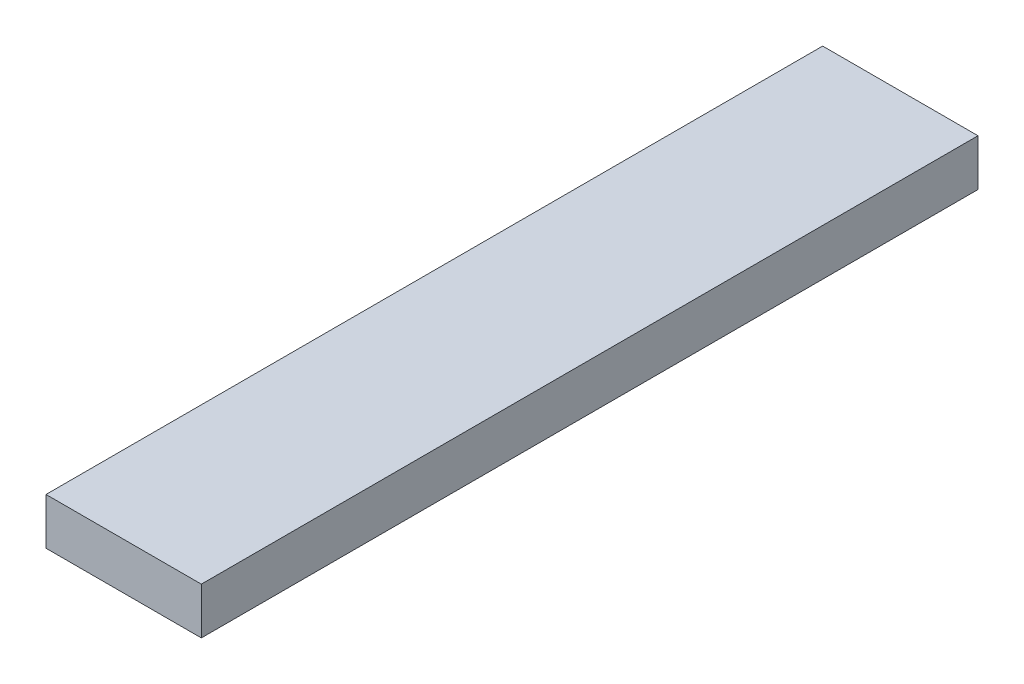
ISO-10303-21;
HEADER;
FILE_DESCRIPTION(('STEP AP214'),'2;1');
FILE_NAME('part.step','',(''),(''),'','','');
FILE_SCHEMA(('AUTOMOTIVE_DESIGN { 1 0 10303 214 1 1 1 1 }'));
ENDSEC;
DATA;
#1=APPLICATION_CONTEXT('core data for automotive mechanical design processes');
#2=APPLICATION_PROTOCOL_DEFINITION('international standard','automotive_design',2000,#1);
#3=PRODUCT_CONTEXT('',#1,'mechanical');
#4=PRODUCT('Part','Part','',(#3));
#5=PRODUCT_RELATED_PRODUCT_CATEGORY('part','',(#4));
#6=PRODUCT_DEFINITION_FORMATION('','',#4);
#7=PRODUCT_DEFINITION_CONTEXT('part definition',#1,'design');
#8=PRODUCT_DEFINITION('design','',#6,#7);
#9=PRODUCT_DEFINITION_SHAPE('','',#8);
#10=(LENGTH_UNIT() NAMED_UNIT(*) SI_UNIT(.MILLI.,.METRE.));
#11=(NAMED_UNIT(*) PLANE_ANGLE_UNIT() SI_UNIT($,.RADIAN.));
#12=(NAMED_UNIT(*) SI_UNIT($,.STERADIAN.) SOLID_ANGLE_UNIT());
#13=UNCERTAINTY_MEASURE_WITH_UNIT(LENGTH_MEASURE(1.E-05),#10,'distance_accuracy_value','');
#14=(GEOMETRIC_REPRESENTATION_CONTEXT(3) GLOBAL_UNCERTAINTY_ASSIGNED_CONTEXT((#13)) GLOBAL_UNIT_ASSIGNED_CONTEXT((#10,
#11,#12)) REPRESENTATION_CONTEXT('',''));
#15=CARTESIAN_POINT('',(0.,0.,0.));
#16=DIRECTION('',(0.,0.,1.));
#17=DIRECTION('',(1.,0.,0.));
#18=AXIS2_PLACEMENT_3D('',#15,#16,#17);
#19=CARTESIAN_POINT('',(0.,3.,0.));
#20=DIRECTION('',(1.,0.,0.));
#21=DIRECTION('',(0.,0.,-1.));
#22=AXIS2_PLACEMENT_3D('',#19,#20,#21);
#23=PLANE('',#22);
#24=DIRECTION('',(0.,0.,1.));
#25=VECTOR('',#24,1.);
#26=CARTESIAN_POINT('',(0.,0.,0.));
#27=LINE('',#26,#25);
#28=CARTESIAN_POINT('',(0.,0.,-50.));
#29=VERTEX_POINT('',#28);
#30=CARTESIAN_POINT('',(0.,0.,0.));
#31=VERTEX_POINT('',#30);
#32=EDGE_CURVE('E96',#29,#31,#27,.T.);
#33=ORIENTED_EDGE('',*,*,#32,.T.);
#34=DIRECTION('',(0.,-1.,0.));
#35=VECTOR('',#34,1.);
#36=CARTESIAN_POINT('',(0.,3.,0.));
#37=LINE('',#36,#35);
#38=CARTESIAN_POINT('',(0.,3.,0.));
#39=VERTEX_POINT('',#38);
#40=EDGE_CURVE('E11',#39,#31,#37,.T.);
#41=ORIENTED_EDGE('',*,*,#40,.F.);
#42=DIRECTION('',(0.,0.,1.));
#43=VECTOR('',#42,1.);
#44=CARTESIAN_POINT('',(0.,3.,0.));
#45=LINE('',#44,#43);
#46=CARTESIAN_POINT('',(0.,3.,-50.));
#47=VERTEX_POINT('',#46);
#48=EDGE_CURVE('E84',#47,#39,#45,.T.);
#49=ORIENTED_EDGE('',*,*,#48,.F.);
#50=DIRECTION('',(0.,-1.,0.));
#51=VECTOR('',#50,1.);
#52=CARTESIAN_POINT('',(0.,3.,-50.));
#53=LINE('',#52,#51);
#54=EDGE_CURVE('E92',#47,#29,#53,.T.);
#55=ORIENTED_EDGE('',*,*,#54,.T.);
#56=EDGE_LOOP('',(#33,#41,#49,#55));
#57=FACE_BOUND('',#56,.T.);
#58=ADVANCED_FACE('F33',(#57),#23,.F.);
#59=CARTESIAN_POINT('',(0.,3.,0.));
#60=DIRECTION('',(0.,0.,-1.));
#61=DIRECTION('',(-1.,0.,0.));
#62=AXIS2_PLACEMENT_3D('',#59,#60,#61);
#63=PLANE('',#62);
#64=DIRECTION('',(1.,0.,0.));
#65=VECTOR('',#64,1.);
#66=CARTESIAN_POINT('',(0.,0.,0.));
#67=LINE('',#66,#65);
#68=CARTESIAN_POINT('',(10.,0.,0.));
#69=VERTEX_POINT('',#68);
#70=EDGE_CURVE('E88',#31,#69,#67,.T.);
#71=ORIENTED_EDGE('',*,*,#70,.T.);
#72=DIRECTION('',(0.,-1.,0.));
#73=VECTOR('',#72,1.);
#74=CARTESIAN_POINT('',(10.,3.,0.));
#75=LINE('',#74,#73);
#76=CARTESIAN_POINT('',(10.,3.,0.));
#77=VERTEX_POINT('',#76);
#78=EDGE_CURVE('E41',#77,#69,#75,.T.);
#79=ORIENTED_EDGE('',*,*,#78,.F.);
#80=DIRECTION('',(1.,0.,0.));
#81=VECTOR('',#80,1.);
#82=CARTESIAN_POINT('',(0.,3.,0.));
#83=LINE('',#82,#81);
#84=EDGE_CURVE('E79',#39,#77,#83,.T.);
#85=ORIENTED_EDGE('',*,*,#84,.F.);
#86=ORIENTED_EDGE('',*,*,#40,.T.);
#87=EDGE_LOOP('',(#71,#79,#85,#86));
#88=FACE_BOUND('',#87,.T.);
#89=ADVANCED_FACE('F87',(#88),#63,.F.);
#90=CARTESIAN_POINT('',(10.,3.,0.));
#91=DIRECTION('',(-1.,0.,0.));
#92=DIRECTION('',(0.,0.,1.));
#93=AXIS2_PLACEMENT_3D('',#90,#91,#92);
#94=PLANE('',#93);
#95=DIRECTION('',(0.,0.,-1.));
#96=VECTOR('',#95,1.);
#97=CARTESIAN_POINT('',(10.,0.,0.));
#98=LINE('',#97,#96);
#99=CARTESIAN_POINT('',(10.,0.,-50.));
#100=VERTEX_POINT('',#99);
#101=EDGE_CURVE('E66',#69,#100,#98,.T.);
#102=ORIENTED_EDGE('',*,*,#101,.T.);
#103=DIRECTION('',(0.,-1.,0.));
#104=VECTOR('',#103,1.);
#105=CARTESIAN_POINT('',(10.,3.,-50.));
#106=LINE('',#105,#104);
#107=CARTESIAN_POINT('',(10.,3.,-50.));
#108=VERTEX_POINT('',#107);
#109=EDGE_CURVE('E89',#108,#100,#106,.T.);
#110=ORIENTED_EDGE('',*,*,#109,.F.);
#111=DIRECTION('',(0.,0.,-1.));
#112=VECTOR('',#111,1.);
#113=CARTESIAN_POINT('',(10.,3.,0.));
#114=LINE('',#113,#112);
#115=EDGE_CURVE('E82',#77,#108,#114,.T.);
#116=ORIENTED_EDGE('',*,*,#115,.F.);
#117=ORIENTED_EDGE('',*,*,#78,.T.);
#118=EDGE_LOOP('',(#102,#110,#116,#117));
#119=FACE_BOUND('',#118,.T.);
#120=ADVANCED_FACE('F90',(#119),#94,.F.);
#121=CARTESIAN_POINT('',(0.,3.,-50.));
#122=DIRECTION('',(0.,0.,1.));
#123=DIRECTION('',(1.,0.,0.));
#124=AXIS2_PLACEMENT_3D('',#121,#122,#123);
#125=PLANE('',#124);
#126=DIRECTION('',(-1.,0.,0.));
#127=VECTOR('',#126,1.);
#128=CARTESIAN_POINT('',(0.,0.,-50.));
#129=LINE('',#128,#127);
#130=EDGE_CURVE('E72',#100,#29,#129,.T.);
#131=ORIENTED_EDGE('',*,*,#130,.T.);
#132=ORIENTED_EDGE('',*,*,#54,.F.);
#133=DIRECTION('',(-1.,0.,0.));
#134=VECTOR('',#133,1.);
#135=CARTESIAN_POINT('',(0.,3.,-50.));
#136=LINE('',#135,#134);
#137=EDGE_CURVE('E49',#108,#47,#136,.T.);
#138=ORIENTED_EDGE('',*,*,#137,.F.);
#139=ORIENTED_EDGE('',*,*,#109,.T.);
#140=EDGE_LOOP('',(#131,#132,#138,#139));
#141=FACE_BOUND('',#140,.T.);
#142=ADVANCED_FACE('F103',(#141),#125,.F.);
#143=CARTESIAN_POINT('',(0.,3.,0.));
#144=DIRECTION('',(0.,-1.,0.));
#145=DIRECTION('',(0.,0.,-1.));
#146=AXIS2_PLACEMENT_3D('',#143,#144,#145);
#147=PLANE('',#146);
#148=ORIENTED_EDGE('',*,*,#48,.T.);
#149=ORIENTED_EDGE('',*,*,#84,.T.);
#150=ORIENTED_EDGE('',*,*,#115,.T.);
#151=ORIENTED_EDGE('',*,*,#137,.T.);
#152=EDGE_LOOP('',(#148,#149,#150,#151));
#153=FACE_BOUND('',#152,.T.);
#154=ADVANCED_FACE('F80',(#153),#147,.F.);
#155=CARTESIAN_POINT('',(0.,0.,0.));
#156=DIRECTION('',(0.,-1.,0.));
#157=DIRECTION('',(0.,0.,-1.));
#158=AXIS2_PLACEMENT_3D('',#155,#156,#157);
#159=PLANE('',#158);
#160=ORIENTED_EDGE('',*,*,#32,.F.);
#161=ORIENTED_EDGE('',*,*,#130,.F.);
#162=ORIENTED_EDGE('',*,*,#101,.F.);
#163=ORIENTED_EDGE('',*,*,#70,.F.);
#164=EDGE_LOOP('',(#160,#161,#162,#163));
#165=FACE_BOUND('',#164,.T.);
#166=ADVANCED_FACE('F106',(#165),#159,.T.);
#167=CLOSED_SHELL('',(#58,#89,#120,#142,#154,#166));
#168=MANIFOLD_SOLID_BREP('B2',#167);
#169=ADVANCED_BREP_SHAPE_REPRESENTATION('',(#18,#168),#14);
#170=SHAPE_DEFINITION_REPRESENTATION(#9,#169);
ENDSEC;
END-ISO-10303-21;
